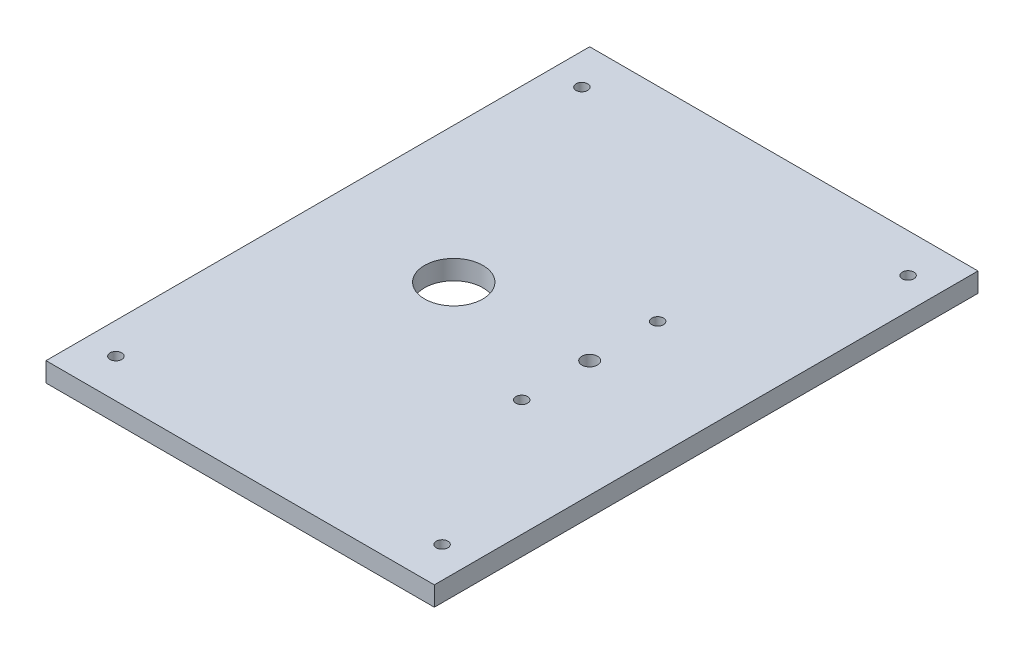
ISO-10303-21;
HEADER;
FILE_DESCRIPTION(('STEP AP214'),'2;1');
FILE_NAME('part.step','',(''),(''),'','','');
FILE_SCHEMA(('AUTOMOTIVE_DESIGN { 1 0 10303 214 1 1 1 1 }'));
ENDSEC;
DATA;
#1=APPLICATION_CONTEXT('core data for automotive mechanical design processes');
#2=APPLICATION_PROTOCOL_DEFINITION('international standard','automotive_design',2000,#1);
#3=PRODUCT_CONTEXT('',#1,'mechanical');
#4=PRODUCT('Part','Part','',(#3));
#5=PRODUCT_RELATED_PRODUCT_CATEGORY('part','',(#4));
#6=PRODUCT_DEFINITION_FORMATION('','',#4);
#7=PRODUCT_DEFINITION_CONTEXT('part definition',#1,'design');
#8=PRODUCT_DEFINITION('design','',#6,#7);
#9=PRODUCT_DEFINITION_SHAPE('','',#8);
#10=(LENGTH_UNIT() NAMED_UNIT(*) SI_UNIT(.MILLI.,.METRE.));
#11=(NAMED_UNIT(*) PLANE_ANGLE_UNIT() SI_UNIT($,.RADIAN.));
#12=(NAMED_UNIT(*) SI_UNIT($,.STERADIAN.) SOLID_ANGLE_UNIT());
#13=UNCERTAINTY_MEASURE_WITH_UNIT(LENGTH_MEASURE(1.E-05),#10,'distance_accuracy_value','');
#14=(GEOMETRIC_REPRESENTATION_CONTEXT(3) GLOBAL_UNCERTAINTY_ASSIGNED_CONTEXT((#13)) GLOBAL_UNIT_ASSIGNED_CONTEXT((#10,
#11,#12)) REPRESENTATION_CONTEXT('',''));
#15=CARTESIAN_POINT('',(0.,0.,0.));
#16=DIRECTION('',(0.,0.,1.));
#17=DIRECTION('',(1.,0.,0.));
#18=AXIS2_PLACEMENT_3D('',#15,#16,#17);
#19=CARTESIAN_POINT('',(50.,5.,-70.));
#20=DIRECTION('',(0.,-1.,0.));
#21=DIRECTION('',(0.,0.,-1.));
#22=AXIS2_PLACEMENT_3D('',#19,#20,#21);
#23=PLANE('',#22);
#24=CARTESIAN_POINT('',(42.,5.,60.));
#25=DIRECTION('',(0.,1.,0.));
#26=DIRECTION('',(0.,0.,1.));
#27=AXIS2_PLACEMENT_3D('',#24,#25,#26);
#28=CIRCLE('',#27,1.5);
#29=CARTESIAN_POINT('',(42.,5.,61.5));
#30=VERTEX_POINT('',#29);
#31=EDGE_CURVE('E159',#30,#30,#28,.T.);
#32=ORIENTED_EDGE('',*,*,#31,.F.);
#33=EDGE_LOOP('',(#32));
#34=FACE_BOUND('',#33,.T.);
#35=CARTESIAN_POINT('',(-42.,5.,60.));
#36=DIRECTION('',(0.,1.,0.));
#37=DIRECTION('',(0.,0.,1.));
#38=AXIS2_PLACEMENT_3D('',#35,#36,#37);
#39=CIRCLE('',#38,1.5);
#40=CARTESIAN_POINT('',(-42.,5.,61.5));
#41=VERTEX_POINT('',#40);
#42=EDGE_CURVE('E153',#41,#41,#39,.T.);
#43=ORIENTED_EDGE('',*,*,#42,.F.);
#44=EDGE_LOOP('',(#43));
#45=FACE_BOUND('',#44,.T.);
#46=CARTESIAN_POINT('',(-42.,5.,-60.));
#47=DIRECTION('',(0.,1.,0.));
#48=DIRECTION('',(0.,0.,1.));
#49=AXIS2_PLACEMENT_3D('',#46,#47,#48);
#50=CIRCLE('',#49,1.5);
#51=CARTESIAN_POINT('',(-42.,5.,-58.5));
#52=VERTEX_POINT('',#51);
#53=EDGE_CURVE('E147',#52,#52,#50,.T.);
#54=ORIENTED_EDGE('',*,*,#53,.F.);
#55=EDGE_LOOP('',(#54));
#56=FACE_BOUND('',#55,.T.);
#57=CARTESIAN_POINT('',(42.,5.,-60.));
#58=DIRECTION('',(0.,1.,0.));
#59=DIRECTION('',(0.,0.,1.));
#60=AXIS2_PLACEMENT_3D('',#57,#58,#59);
#61=CIRCLE('',#60,1.5);
#62=CARTESIAN_POINT('',(42.,5.,-58.5));
#63=VERTEX_POINT('',#62);
#64=EDGE_CURVE('E141',#63,#63,#61,.T.);
#65=ORIENTED_EDGE('',*,*,#64,.F.);
#66=EDGE_LOOP('',(#65));
#67=FACE_BOUND('',#66,.T.);
#68=CARTESIAN_POINT('',(20.,5.,17.5));
#69=DIRECTION('',(0.,1.,0.));
#70=DIRECTION('',(0.,0.,1.));
#71=AXIS2_PLACEMENT_3D('',#68,#69,#70);
#72=CIRCLE('',#71,1.5);
#73=CARTESIAN_POINT('',(20.,5.,19.));
#74=VERTEX_POINT('',#73);
#75=EDGE_CURVE('E124',#74,#74,#72,.T.);
#76=ORIENTED_EDGE('',*,*,#75,.F.);
#77=EDGE_LOOP('',(#76));
#78=FACE_BOUND('',#77,.T.);
#79=CARTESIAN_POINT('',(-15.,5.,0.));
#80=DIRECTION('',(0.,1.,0.));
#81=DIRECTION('',(0.,0.,1.));
#82=AXIS2_PLACEMENT_3D('',#79,#80,#81);
#83=CIRCLE('',#82,7.5);
#84=CARTESIAN_POINT('',(-15.,5.,7.50000000000001));
#85=VERTEX_POINT('',#84);
#86=EDGE_CURVE('E103',#85,#85,#83,.T.);
#87=ORIENTED_EDGE('',*,*,#86,.F.);
#88=EDGE_LOOP('',(#87));
#89=FACE_BOUND('',#88,.T.);
#90=DIRECTION('',(0.,0.,-1.));
#91=VECTOR('',#90,1.);
#92=CARTESIAN_POINT('',(50.,5.,70.));
#93=LINE('',#92,#91);
#94=CARTESIAN_POINT('',(50.,5.,70.));
#95=VERTEX_POINT('',#94);
#96=CARTESIAN_POINT('',(50.,5.,-70.));
#97=VERTEX_POINT('',#96);
#98=EDGE_CURVE('E88',#95,#97,#93,.T.);
#99=ORIENTED_EDGE('',*,*,#98,.T.);
#100=DIRECTION('',(-1.,0.,0.));
#101=VECTOR('',#100,1.);
#102=CARTESIAN_POINT('',(-50.,5.,-70.));
#103=LINE('',#102,#101);
#104=CARTESIAN_POINT('',(-50.,5.,-70.));
#105=VERTEX_POINT('',#104);
#106=EDGE_CURVE('E83',#97,#105,#103,.T.);
#107=ORIENTED_EDGE('',*,*,#106,.T.);
#108=DIRECTION('',(0.,0.,1.));
#109=VECTOR('',#108,1.);
#110=CARTESIAN_POINT('',(-50.,5.,70.));
#111=LINE('',#110,#109);
#112=CARTESIAN_POINT('',(-50.,5.,70.));
#113=VERTEX_POINT('',#112);
#114=EDGE_CURVE('E86',#105,#113,#111,.T.);
#115=ORIENTED_EDGE('',*,*,#114,.T.);
#116=DIRECTION('',(1.,0.,0.));
#117=VECTOR('',#116,1.);
#118=CARTESIAN_POINT('',(-50.,5.,70.));
#119=LINE('',#118,#117);
#120=EDGE_CURVE('E53',#113,#95,#119,.T.);
#121=ORIENTED_EDGE('',*,*,#120,.T.);
#122=EDGE_LOOP('',(#99,#107,#115,#121));
#123=FACE_BOUND('',#122,.T.);
#124=CARTESIAN_POINT('',(20.,5.,0.));
#125=DIRECTION('',(0.,1.,0.));
#126=DIRECTION('',(0.,0.,1.));
#127=AXIS2_PLACEMENT_3D('',#124,#125,#126);
#128=CIRCLE('',#127,2.);
#129=CARTESIAN_POINT('',(20.,5.,2.));
#130=VERTEX_POINT('',#129);
#131=EDGE_CURVE('E118',#130,#130,#128,.T.);
#132=ORIENTED_EDGE('',*,*,#131,.F.);
#133=EDGE_LOOP('',(#132));
#134=FACE_BOUND('',#133,.T.);
#135=CARTESIAN_POINT('',(20.,5.,-17.5));
#136=DIRECTION('',(0.,1.,0.));
#137=DIRECTION('',(0.,0.,1.));
#138=AXIS2_PLACEMENT_3D('',#135,#136,#137);
#139=CIRCLE('',#138,1.50000000000001);
#140=CARTESIAN_POINT('',(20.,5.,-16.));
#141=VERTEX_POINT('',#140);
#142=EDGE_CURVE('E130',#141,#141,#139,.T.);
#143=ORIENTED_EDGE('',*,*,#142,.F.);
#144=EDGE_LOOP('',(#143));
#145=FACE_BOUND('',#144,.T.);
#146=ADVANCED_FACE('F36',(#34,#45,#56,#67,#78,#89,#123,#134,#145),#23,.F.);
#147=CARTESIAN_POINT('',(50.,0.,-70.));
#148=DIRECTION('',(0.,-1.,0.));
#149=DIRECTION('',(0.,0.,-1.));
#150=AXIS2_PLACEMENT_3D('',#147,#148,#149);
#151=PLANE('',#150);
#152=CARTESIAN_POINT('',(42.,0.,60.));
#153=DIRECTION('',(0.,1.,0.));
#154=DIRECTION('',(0.,0.,1.));
#155=AXIS2_PLACEMENT_3D('',#152,#153,#154);
#156=CIRCLE('',#155,1.5);
#157=CARTESIAN_POINT('',(42.,0.,61.5));
#158=VERTEX_POINT('',#157);
#159=EDGE_CURVE('E156',#158,#158,#156,.T.);
#160=ORIENTED_EDGE('',*,*,#159,.T.);
#161=EDGE_LOOP('',(#160));
#162=FACE_BOUND('',#161,.T.);
#163=CARTESIAN_POINT('',(-42.,0.,60.));
#164=DIRECTION('',(0.,1.,0.));
#165=DIRECTION('',(0.,0.,1.));
#166=AXIS2_PLACEMENT_3D('',#163,#164,#165);
#167=CIRCLE('',#166,1.5);
#168=CARTESIAN_POINT('',(-42.,0.,61.5));
#169=VERTEX_POINT('',#168);
#170=EDGE_CURVE('E150',#169,#169,#167,.T.);
#171=ORIENTED_EDGE('',*,*,#170,.T.);
#172=EDGE_LOOP('',(#171));
#173=FACE_BOUND('',#172,.T.);
#174=CARTESIAN_POINT('',(-42.,0.,-60.));
#175=DIRECTION('',(0.,1.,0.));
#176=DIRECTION('',(0.,0.,1.));
#177=AXIS2_PLACEMENT_3D('',#174,#175,#176);
#178=CIRCLE('',#177,1.5);
#179=CARTESIAN_POINT('',(-42.,0.,-58.5));
#180=VERTEX_POINT('',#179);
#181=EDGE_CURVE('E144',#180,#180,#178,.T.);
#182=ORIENTED_EDGE('',*,*,#181,.T.);
#183=EDGE_LOOP('',(#182));
#184=FACE_BOUND('',#183,.T.);
#185=CARTESIAN_POINT('',(42.,0.,-60.));
#186=DIRECTION('',(0.,1.,0.));
#187=DIRECTION('',(0.,0.,1.));
#188=AXIS2_PLACEMENT_3D('',#185,#186,#187);
#189=CIRCLE('',#188,1.5);
#190=CARTESIAN_POINT('',(42.,0.,-58.5));
#191=VERTEX_POINT('',#190);
#192=EDGE_CURVE('E136',#191,#191,#189,.T.);
#193=ORIENTED_EDGE('',*,*,#192,.T.);
#194=EDGE_LOOP('',(#193));
#195=FACE_BOUND('',#194,.T.);
#196=CARTESIAN_POINT('',(20.,0.,17.5));
#197=DIRECTION('',(0.,1.,0.));
#198=DIRECTION('',(0.,0.,1.));
#199=AXIS2_PLACEMENT_3D('',#196,#197,#198);
#200=CIRCLE('',#199,1.5);
#201=CARTESIAN_POINT('',(20.,0.,19.));
#202=VERTEX_POINT('',#201);
#203=EDGE_CURVE('E127',#202,#202,#200,.T.);
#204=ORIENTED_EDGE('',*,*,#203,.T.);
#205=EDGE_LOOP('',(#204));
#206=FACE_BOUND('',#205,.T.);
#207=CARTESIAN_POINT('',(-15.,0.,0.));
#208=DIRECTION('',(0.,1.,0.));
#209=DIRECTION('',(0.,0.,1.));
#210=AXIS2_PLACEMENT_3D('',#207,#208,#209);
#211=CIRCLE('',#210,7.5);
#212=CARTESIAN_POINT('',(-15.,0.,7.50000000000001));
#213=VERTEX_POINT('',#212);
#214=EDGE_CURVE('E115',#213,#213,#211,.T.);
#215=ORIENTED_EDGE('',*,*,#214,.T.);
#216=EDGE_LOOP('',(#215));
#217=FACE_BOUND('',#216,.T.);
#218=DIRECTION('',(0.,0.,-1.));
#219=VECTOR('',#218,1.);
#220=CARTESIAN_POINT('',(50.,0.,70.));
#221=LINE('',#220,#219);
#222=CARTESIAN_POINT('',(50.,0.,70.));
#223=VERTEX_POINT('',#222);
#224=CARTESIAN_POINT('',(50.,0.,-70.));
#225=VERTEX_POINT('',#224);
#226=EDGE_CURVE('E100',#223,#225,#221,.T.);
#227=ORIENTED_EDGE('',*,*,#226,.F.);
#228=DIRECTION('',(1.,0.,0.));
#229=VECTOR('',#228,1.);
#230=CARTESIAN_POINT('',(-50.,0.,70.));
#231=LINE('',#230,#229);
#232=CARTESIAN_POINT('',(-50.,0.,70.));
#233=VERTEX_POINT('',#232);
#234=EDGE_CURVE('E76',#233,#223,#231,.T.);
#235=ORIENTED_EDGE('',*,*,#234,.F.);
#236=DIRECTION('',(0.,0.,1.));
#237=VECTOR('',#236,1.);
#238=CARTESIAN_POINT('',(-50.,0.,70.));
#239=LINE('',#238,#237);
#240=CARTESIAN_POINT('',(-50.,0.,-70.));
#241=VERTEX_POINT('',#240);
#242=EDGE_CURVE('E70',#241,#233,#239,.T.);
#243=ORIENTED_EDGE('',*,*,#242,.F.);
#244=DIRECTION('',(-1.,0.,0.));
#245=VECTOR('',#244,1.);
#246=CARTESIAN_POINT('',(-50.,0.,-70.));
#247=LINE('',#246,#245);
#248=EDGE_CURVE('E92',#225,#241,#247,.T.);
#249=ORIENTED_EDGE('',*,*,#248,.F.);
#250=EDGE_LOOP('',(#227,#235,#243,#249));
#251=FACE_BOUND('',#250,.T.);
#252=CARTESIAN_POINT('',(20.,0.,0.));
#253=DIRECTION('',(0.,1.,0.));
#254=DIRECTION('',(0.,0.,1.));
#255=AXIS2_PLACEMENT_3D('',#252,#253,#254);
#256=CIRCLE('',#255,2.);
#257=CARTESIAN_POINT('',(20.,0.,2.));
#258=VERTEX_POINT('',#257);
#259=EDGE_CURVE('E121',#258,#258,#256,.T.);
#260=ORIENTED_EDGE('',*,*,#259,.T.);
#261=EDGE_LOOP('',(#260));
#262=FACE_BOUND('',#261,.T.);
#263=CARTESIAN_POINT('',(20.,0.,-17.5));
#264=DIRECTION('',(0.,1.,0.));
#265=DIRECTION('',(0.,0.,1.));
#266=AXIS2_PLACEMENT_3D('',#263,#264,#265);
#267=CIRCLE('',#266,1.50000000000001);
#268=CARTESIAN_POINT('',(20.,0.,-16.));
#269=VERTEX_POINT('',#268);
#270=EDGE_CURVE('E133',#269,#269,#267,.T.);
#271=ORIENTED_EDGE('',*,*,#270,.T.);
#272=EDGE_LOOP('',(#271));
#273=FACE_BOUND('',#272,.T.);
#274=ADVANCED_FACE('F111',(#162,#173,#184,#195,#206,#217,#251,#262,#273),#151,.T.);
#275=CARTESIAN_POINT('',(50.,5.,70.));
#276=DIRECTION('',(-1.,0.,0.));
#277=DIRECTION('',(0.,0.,1.));
#278=AXIS2_PLACEMENT_3D('',#275,#276,#277);
#279=PLANE('',#278);
#280=ORIENTED_EDGE('',*,*,#226,.T.);
#281=DIRECTION('',(0.,-1.,0.));
#282=VECTOR('',#281,1.);
#283=CARTESIAN_POINT('',(50.,5.,-70.));
#284=LINE('',#283,#282);
#285=EDGE_CURVE('E11',#97,#225,#284,.T.);
#286=ORIENTED_EDGE('',*,*,#285,.F.);
#287=ORIENTED_EDGE('',*,*,#98,.F.);
#288=DIRECTION('',(0.,-1.,0.));
#289=VECTOR('',#288,1.);
#290=CARTESIAN_POINT('',(50.,5.,70.));
#291=LINE('',#290,#289);
#292=EDGE_CURVE('E96',#95,#223,#291,.T.);
#293=ORIENTED_EDGE('',*,*,#292,.T.);
#294=EDGE_LOOP('',(#280,#286,#287,#293));
#295=FACE_BOUND('',#294,.T.);
#296=ADVANCED_FACE('F38',(#295),#279,.F.);
#297=CARTESIAN_POINT('',(-50.,5.,-70.));
#298=DIRECTION('',(0.,0.,1.));
#299=DIRECTION('',(1.,0.,0.));
#300=AXIS2_PLACEMENT_3D('',#297,#298,#299);
#301=PLANE('',#300);
#302=ORIENTED_EDGE('',*,*,#248,.T.);
#303=DIRECTION('',(0.,-1.,0.));
#304=VECTOR('',#303,1.);
#305=CARTESIAN_POINT('',(-50.,5.,-70.));
#306=LINE('',#305,#304);
#307=EDGE_CURVE('E45',#105,#241,#306,.T.);
#308=ORIENTED_EDGE('',*,*,#307,.F.);
#309=ORIENTED_EDGE('',*,*,#106,.F.);
#310=ORIENTED_EDGE('',*,*,#285,.T.);
#311=EDGE_LOOP('',(#302,#308,#309,#310));
#312=FACE_BOUND('',#311,.T.);
#313=ADVANCED_FACE('F91',(#312),#301,.F.);
#314=CARTESIAN_POINT('',(-50.,5.,70.));
#315=DIRECTION('',(1.,0.,0.));
#316=DIRECTION('',(0.,0.,-1.));
#317=AXIS2_PLACEMENT_3D('',#314,#315,#316);
#318=PLANE('',#317);
#319=ORIENTED_EDGE('',*,*,#242,.T.);
#320=DIRECTION('',(0.,-1.,0.));
#321=VECTOR('',#320,1.);
#322=CARTESIAN_POINT('',(-50.,5.,70.));
#323=LINE('',#322,#321);
#324=EDGE_CURVE('E93',#113,#233,#323,.T.);
#325=ORIENTED_EDGE('',*,*,#324,.F.);
#326=ORIENTED_EDGE('',*,*,#114,.F.);
#327=ORIENTED_EDGE('',*,*,#307,.T.);
#328=EDGE_LOOP('',(#319,#325,#326,#327));
#329=FACE_BOUND('',#328,.T.);
#330=ADVANCED_FACE('F94',(#329),#318,.F.);
#331=CARTESIAN_POINT('',(-50.,5.,70.));
#332=DIRECTION('',(0.,0.,-1.));
#333=DIRECTION('',(-1.,0.,0.));
#334=AXIS2_PLACEMENT_3D('',#331,#332,#333);
#335=PLANE('',#334);
#336=ORIENTED_EDGE('',*,*,#234,.T.);
#337=ORIENTED_EDGE('',*,*,#292,.F.);
#338=ORIENTED_EDGE('',*,*,#120,.F.);
#339=ORIENTED_EDGE('',*,*,#324,.T.);
#340=EDGE_LOOP('',(#336,#337,#338,#339));
#341=FACE_BOUND('',#340,.T.);
#342=ADVANCED_FACE('F108',(#341),#335,.F.);
#343=CARTESIAN_POINT('',(-15.,5.,0.));
#344=DIRECTION('',(0.,-1.,0.));
#345=DIRECTION('',(0.,0.,-1.));
#346=AXIS2_PLACEMENT_3D('',#343,#344,#345);
#347=CYLINDRICAL_SURFACE('',#346,7.5);
#348=ORIENTED_EDGE('',*,*,#86,.T.);
#349=EDGE_LOOP('',(#348));
#350=FACE_BOUND('',#349,.T.);
#351=ORIENTED_EDGE('',*,*,#214,.F.);
#352=EDGE_LOOP('',(#351));
#353=FACE_BOUND('',#352,.T.);
#354=ADVANCED_FACE('F178',(#350,#353),#347,.F.);
#355=CARTESIAN_POINT('',(20.,5.,0.));
#356=DIRECTION('',(0.,-1.,0.));
#357=DIRECTION('',(0.,0.,-1.));
#358=AXIS2_PLACEMENT_3D('',#355,#356,#357);
#359=CYLINDRICAL_SURFACE('',#358,2.);
#360=ORIENTED_EDGE('',*,*,#131,.T.);
#361=EDGE_LOOP('',(#360));
#362=FACE_BOUND('',#361,.T.);
#363=ORIENTED_EDGE('',*,*,#259,.F.);
#364=EDGE_LOOP('',(#363));
#365=FACE_BOUND('',#364,.T.);
#366=ADVANCED_FACE('F181',(#362,#365),#359,.F.);
#367=CARTESIAN_POINT('',(20.,5.,17.5));
#368=DIRECTION('',(0.,-1.,0.));
#369=DIRECTION('',(0.,0.,-1.));
#370=AXIS2_PLACEMENT_3D('',#367,#368,#369);
#371=CYLINDRICAL_SURFACE('',#370,1.5);
#372=ORIENTED_EDGE('',*,*,#75,.T.);
#373=EDGE_LOOP('',(#372));
#374=FACE_BOUND('',#373,.T.);
#375=ORIENTED_EDGE('',*,*,#203,.F.);
#376=EDGE_LOOP('',(#375));
#377=FACE_BOUND('',#376,.T.);
#378=ADVANCED_FACE('F218',(#374,#377),#371,.F.);
#379=CARTESIAN_POINT('',(20.,5.,-17.5));
#380=DIRECTION('',(0.,-1.,0.));
#381=DIRECTION('',(0.,0.,-1.));
#382=AXIS2_PLACEMENT_3D('',#379,#380,#381);
#383=CYLINDRICAL_SURFACE('',#382,1.50000000000001);
#384=ORIENTED_EDGE('',*,*,#142,.T.);
#385=EDGE_LOOP('',(#384));
#386=FACE_BOUND('',#385,.T.);
#387=ORIENTED_EDGE('',*,*,#270,.F.);
#388=EDGE_LOOP('',(#387));
#389=FACE_BOUND('',#388,.T.);
#390=ADVANCED_FACE('F226',(#386,#389),#383,.F.);
#391=CARTESIAN_POINT('',(42.,5.,-60.));
#392=DIRECTION('',(0.,1.,0.));
#393=DIRECTION('',(0.,0.,1.));
#394=AXIS2_PLACEMENT_3D('',#391,#392,#393);
#395=CYLINDRICAL_SURFACE('',#394,1.5);
#396=ORIENTED_EDGE('',*,*,#192,.F.);
#397=EDGE_LOOP('',(#396));
#398=FACE_BOUND('',#397,.T.);
#399=ORIENTED_EDGE('',*,*,#64,.T.);
#400=EDGE_LOOP('',(#399));
#401=FACE_BOUND('',#400,.T.);
#402=ADVANCED_FACE('F234',(#398,#401),#395,.F.);
#403=CARTESIAN_POINT('',(-42.,5.,-60.));
#404=DIRECTION('',(0.,1.,0.));
#405=DIRECTION('',(0.,0.,1.));
#406=AXIS2_PLACEMENT_3D('',#403,#404,#405);
#407=CYLINDRICAL_SURFACE('',#406,1.5);
#408=ORIENTED_EDGE('',*,*,#181,.F.);
#409=EDGE_LOOP('',(#408));
#410=FACE_BOUND('',#409,.T.);
#411=ORIENTED_EDGE('',*,*,#53,.T.);
#412=EDGE_LOOP('',(#411));
#413=FACE_BOUND('',#412,.T.);
#414=ADVANCED_FACE('F243',(#410,#413),#407,.F.);
#415=CARTESIAN_POINT('',(-42.,5.,60.));
#416=DIRECTION('',(0.,1.,0.));
#417=DIRECTION('',(0.,0.,1.));
#418=AXIS2_PLACEMENT_3D('',#415,#416,#417);
#419=CYLINDRICAL_SURFACE('',#418,1.5);
#420=ORIENTED_EDGE('',*,*,#170,.F.);
#421=EDGE_LOOP('',(#420));
#422=FACE_BOUND('',#421,.T.);
#423=ORIENTED_EDGE('',*,*,#42,.T.);
#424=EDGE_LOOP('',(#423));
#425=FACE_BOUND('',#424,.T.);
#426=ADVANCED_FACE('F252',(#422,#425),#419,.F.);
#427=CARTESIAN_POINT('',(42.,5.,60.));
#428=DIRECTION('',(0.,1.,0.));
#429=DIRECTION('',(0.,0.,1.));
#430=AXIS2_PLACEMENT_3D('',#427,#428,#429);
#431=CYLINDRICAL_SURFACE('',#430,1.5);
#432=ORIENTED_EDGE('',*,*,#159,.F.);
#433=EDGE_LOOP('',(#432));
#434=FACE_BOUND('',#433,.T.);
#435=ORIENTED_EDGE('',*,*,#31,.T.);
#436=EDGE_LOOP('',(#435));
#437=FACE_BOUND('',#436,.T.);
#438=ADVANCED_FACE('F163',(#434,#437),#431,.F.);
#439=CLOSED_SHELL('',(#146,#274,#296,#313,#330,#342,#354,#366,#378,#390,#402,#414,#426,#438));
#440=MANIFOLD_SOLID_BREP('B2',#439);
#441=ADVANCED_BREP_SHAPE_REPRESENTATION('',(#18,#440),#14);
#442=SHAPE_DEFINITION_REPRESENTATION(#9,#441);
ENDSEC;
END-ISO-10303-21;
